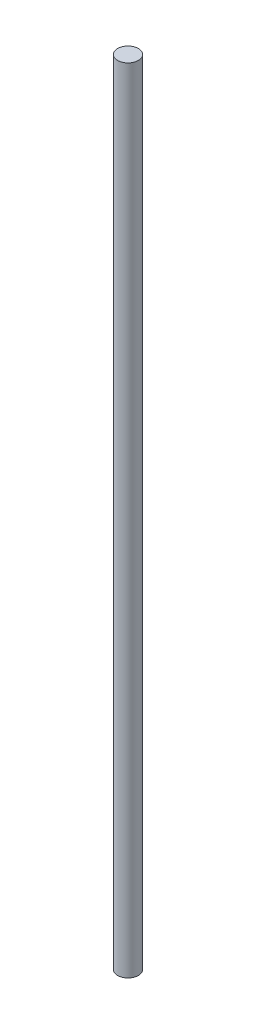
ISO-10303-21;
HEADER;
FILE_DESCRIPTION(('STEP AP214'),'2;1');
FILE_NAME('part.step','',(''),(''),'','','');
FILE_SCHEMA(('AUTOMOTIVE_DESIGN { 1 0 10303 214 1 1 1 1 }'));
ENDSEC;
DATA;
#1=APPLICATION_CONTEXT('core data for automotive mechanical design processes');
#2=APPLICATION_PROTOCOL_DEFINITION('international standard','automotive_design',2000,#1);
#3=PRODUCT_CONTEXT('',#1,'mechanical');
#4=PRODUCT('Part','Part','',(#3));
#5=PRODUCT_RELATED_PRODUCT_CATEGORY('part','',(#4));
#6=PRODUCT_DEFINITION_FORMATION('','',#4);
#7=PRODUCT_DEFINITION_CONTEXT('part definition',#1,'design');
#8=PRODUCT_DEFINITION('design','',#6,#7);
#9=PRODUCT_DEFINITION_SHAPE('','',#8);
#10=(LENGTH_UNIT() NAMED_UNIT(*) SI_UNIT(.MILLI.,.METRE.));
#11=(NAMED_UNIT(*) PLANE_ANGLE_UNIT() SI_UNIT($,.RADIAN.));
#12=(NAMED_UNIT(*) SI_UNIT($,.STERADIAN.) SOLID_ANGLE_UNIT());
#13=UNCERTAINTY_MEASURE_WITH_UNIT(LENGTH_MEASURE(1.E-05),#10,'distance_accuracy_value','');
#14=(GEOMETRIC_REPRESENTATION_CONTEXT(3) GLOBAL_UNCERTAINTY_ASSIGNED_CONTEXT((#13)) GLOBAL_UNIT_ASSIGNED_CONTEXT((#10,
#11,#12)) REPRESENTATION_CONTEXT('',''));
#15=CARTESIAN_POINT('',(0.,0.,0.));
#16=DIRECTION('',(0.,0.,1.));
#17=DIRECTION('',(1.,0.,0.));
#18=AXIS2_PLACEMENT_3D('',#15,#16,#17);
#19=CARTESIAN_POINT('',(0.,229.5,0.));
#20=DIRECTION('',(0.,-1.,0.));
#21=DIRECTION('',(0.,0.,-1.));
#22=AXIS2_PLACEMENT_3D('',#19,#20,#21);
#23=CYLINDRICAL_SURFACE('',#22,3.);
#24=CARTESIAN_POINT('',(0.,229.5,0.));
#25=DIRECTION('',(0.,1.,0.));
#26=DIRECTION('',(0.,0.,1.));
#27=AXIS2_PLACEMENT_3D('',#24,#25,#26);
#28=CIRCLE('',#27,3.);
#29=CARTESIAN_POINT('',(0.,229.5,3.));
#30=VERTEX_POINT('',#29);
#31=EDGE_CURVE('E10',#30,#30,#28,.T.);
#32=ORIENTED_EDGE('',*,*,#31,.F.);
#33=EDGE_LOOP('',(#32));
#34=FACE_BOUND('',#33,.T.);
#35=CARTESIAN_POINT('',(0.,0.,0.));
#36=DIRECTION('',(0.,1.,0.));
#37=DIRECTION('',(0.,0.,1.));
#38=AXIS2_PLACEMENT_3D('',#35,#36,#37);
#39=CIRCLE('',#38,3.);
#40=CARTESIAN_POINT('',(0.,0.,3.));
#41=VERTEX_POINT('',#40);
#42=EDGE_CURVE('E44',#41,#41,#39,.T.);
#43=ORIENTED_EDGE('',*,*,#42,.T.);
#44=EDGE_LOOP('',(#43));
#45=FACE_BOUND('',#44,.T.);
#46=ADVANCED_FACE('F41',(#34,#45),#23,.T.);
#47=CARTESIAN_POINT('',(0.,229.5,0.));
#48=DIRECTION('',(0.,1.,0.));
#49=DIRECTION('',(0.,0.,1.));
#50=AXIS2_PLACEMENT_3D('',#47,#48,#49);
#51=PLANE('',#50);
#52=ORIENTED_EDGE('',*,*,#31,.T.);
#53=EDGE_LOOP('',(#52));
#54=FACE_BOUND('',#53,.T.);
#55=ADVANCED_FACE('F58',(#54),#51,.T.);
#56=CARTESIAN_POINT('',(0.,0.,0.));
#57=DIRECTION('',(0.,1.,0.));
#58=DIRECTION('',(0.,0.,1.));
#59=AXIS2_PLACEMENT_3D('',#56,#57,#58);
#60=PLANE('',#59);
#61=ORIENTED_EDGE('',*,*,#42,.F.);
#62=EDGE_LOOP('',(#61));
#63=FACE_BOUND('',#62,.T.);
#64=ADVANCED_FACE('F56',(#63),#60,.F.);
#65=CLOSED_SHELL('',(#46,#55,#64));
#66=MANIFOLD_SOLID_BREP('B2',#65);
#67=ADVANCED_BREP_SHAPE_REPRESENTATION('',(#18,#66),#14);
#68=SHAPE_DEFINITION_REPRESENTATION(#9,#67);
ENDSEC;
END-ISO-10303-21;
